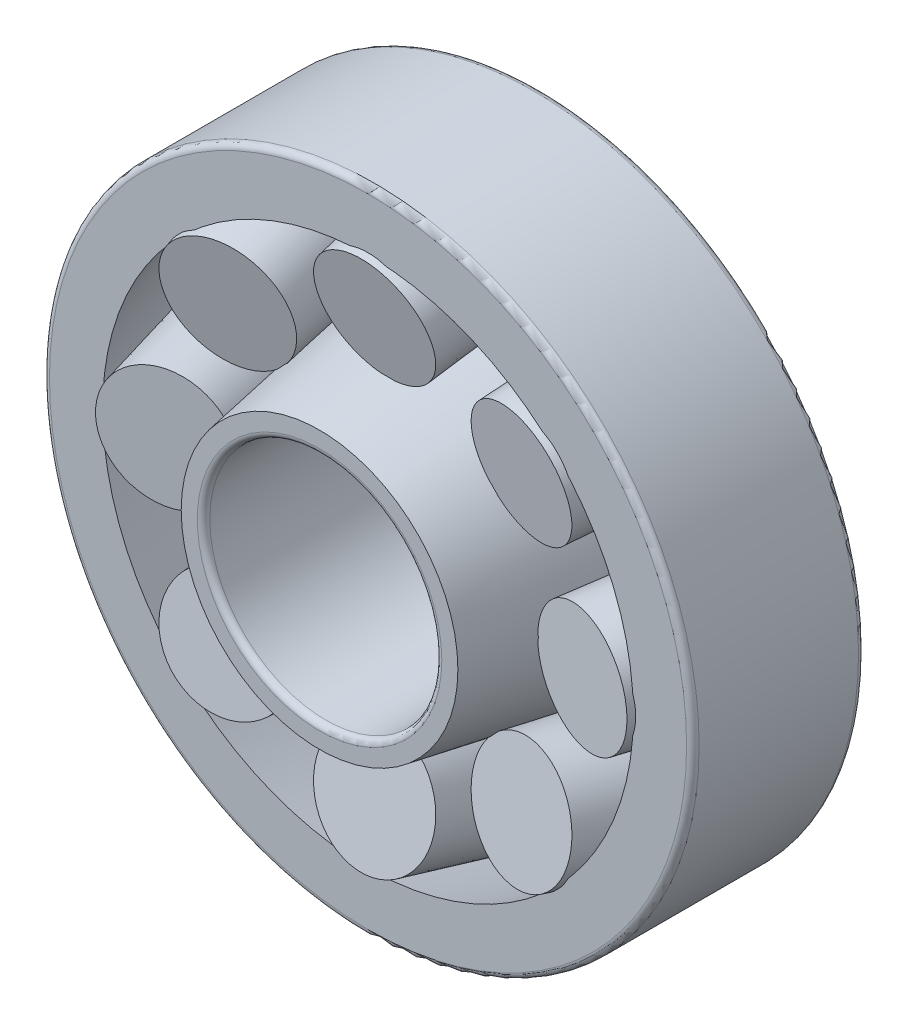
ISO-10303-21;
HEADER;
FILE_DESCRIPTION(('STEP AP214'),'2;1');
FILE_NAME('part.step','',(''),(''),'','','');
FILE_SCHEMA(('AUTOMOTIVE_DESIGN { 1 0 10303 214 1 1 1 1 }'));
ENDSEC;
DATA;
#1=APPLICATION_CONTEXT('core data for automotive mechanical design processes');
#2=APPLICATION_PROTOCOL_DEFINITION('international standard','automotive_design',2000,#1);
#3=PRODUCT_CONTEXT('',#1,'mechanical');
#4=PRODUCT('Part','Part','',(#3));
#5=PRODUCT_RELATED_PRODUCT_CATEGORY('part','',(#4));
#6=PRODUCT_DEFINITION_FORMATION('','',#4);
#7=PRODUCT_DEFINITION_CONTEXT('part definition',#1,'design');
#8=PRODUCT_DEFINITION('design','',#6,#7);
#9=PRODUCT_DEFINITION_SHAPE('','',#8);
#10=(LENGTH_UNIT() NAMED_UNIT(*) SI_UNIT(.MILLI.,.METRE.));
#11=(NAMED_UNIT(*) PLANE_ANGLE_UNIT() SI_UNIT($,.RADIAN.));
#12=(NAMED_UNIT(*) SI_UNIT($,.STERADIAN.) SOLID_ANGLE_UNIT());
#13=UNCERTAINTY_MEASURE_WITH_UNIT(LENGTH_MEASURE(1.E-05),#10,'distance_accuracy_value','');
#14=(GEOMETRIC_REPRESENTATION_CONTEXT(3) GLOBAL_UNCERTAINTY_ASSIGNED_CONTEXT((#13)) GLOBAL_UNIT_ASSIGNED_CONTEXT((#10,
#11,#12)) REPRESENTATION_CONTEXT('',''));
#15=CARTESIAN_POINT('',(0.,0.,0.));
#16=DIRECTION('',(0.,0.,1.));
#17=DIRECTION('',(1.,0.,0.));
#18=AXIS2_PLACEMENT_3D('',#15,#16,#17);
#19=CARTESIAN_POINT('',(9.49301667362591,-9.49301667362592,3.56250031236652));
#20=DIRECTION('',(0.159501582379891,-0.159501582379891,-0.974227124666842));
#21=DIRECTION('',(-0.688882606267796,0.688882606267796,-0.225569301021612));
#22=AXIS2_PLACEMENT_3D('',#19,#20,#21);
#23=PLANE('',#22);
#24=CARTESIAN_POINT('',(9.49301662248491,-9.49301662248491,3.56250062473305));
#25=DIRECTION('',(0.159501582379891,-0.159501582379891,-0.974227124666842));
#26=DIRECTION('',(-0.688882606267796,0.688882606267796,-0.225569301021612));
#27=AXIS2_PLACEMENT_3D('',#24,#25,#26);
#28=CIRCLE('',#27,3.8533147965187);
#29=CARTESIAN_POINT('',(6.83853508268885,-6.83853508268885,2.69331109946609));
#30=VERTEX_POINT('',#29);
#31=EDGE_CURVE('E11',#30,#30,#28,.T.);
#32=ORIENTED_EDGE('',*,*,#31,.F.);
#33=EDGE_LOOP('',(#32));
#34=FACE_BOUND('',#33,.T.);
#35=ADVANCED_FACE('F42',(#34),#23,.F.);
#36=CARTESIAN_POINT('',(9.49301662248491,-9.49301662248491,3.56250062473305));
#37=DIRECTION('',(0.159501582379891,-0.159501582379891,-0.974227124666842));
#38=DIRECTION('',(-0.688882606267796,0.688882606267796,-0.225569301021612));
#39=AXIS2_PLACEMENT_3D('',#36,#37,#38);
#40=CONICAL_SURFACE('',#39,3.8533147965187,0.0537348200458138);
#41=CARTESIAN_POINT('',(10.892832765174,-10.892832765174,-4.98750142168032));
#42=DIRECTION('',(0.159501582379891,-0.159501582379891,-0.974227124666842));
#43=DIRECTION('',(-0.688882606267796,0.688882606267796,-0.225569301021612));
#44=AXIS2_PLACEMENT_3D('',#41,#42,#43);
#45=CIRCLE('',#44,4.32535618659756);
#46=CARTESIAN_POINT('',(7.91317012231415,-7.91317012231416,-5.96316899336063));
#47=VERTEX_POINT('',#46);
#48=EDGE_CURVE('E48',#47,#47,#45,.T.);
#49=ORIENTED_EDGE('',*,*,#48,.F.);
#50=EDGE_LOOP('',(#49));
#51=FACE_BOUND('',#50,.T.);
#52=ORIENTED_EDGE('',*,*,#31,.T.);
#53=EDGE_LOOP('',(#52));
#54=FACE_BOUND('',#53,.T.);
#55=ADVANCED_FACE('F56',(#51,#54),#40,.T.);
#56=CARTESIAN_POINT('',(13.8724952916543,-13.8724952916543,-4.01183313915984));
#57=DIRECTION('',(-0.159501582379891,0.159501582379891,0.974227124666842));
#58=DIRECTION('',(0.688882606267796,-0.688882606267796,0.225569301021612));
#59=AXIS2_PLACEMENT_3D('',#56,#57,#58);
#60=PLANE('',#59);
#61=ORIENTED_EDGE('',*,*,#48,.T.);
#62=EDGE_LOOP('',(#61));
#63=FACE_BOUND('',#62,.T.);
#64=ADVANCED_FACE('F54',(#63),#60,.F.);
#65=CLOSED_SHELL('',(#35,#55,#64));
#66=MANIFOLD_SOLID_BREP('B2',#65);
#67=CARTESIAN_POINT('',(0.,-13.4251529276757,3.56250031236652));
#68=DIRECTION('',(0.,-0.225569301021612,-0.974227124666842));
#69=DIRECTION('',(0.,0.974227124666842,-0.225569301021612));
#70=AXIS2_PLACEMENT_3D('',#67,#68,#69);
#71=PLANE('',#70);
#72=CARTESIAN_POINT('',(0.,-13.4251528553514,3.56250062473305));
#73=DIRECTION('',(0.,-0.225569301021612,-0.974227124666842));
#74=DIRECTION('',(0.,0.974227124666842,-0.225569301021612));
#75=AXIS2_PLACEMENT_3D('',#72,#73,#74);
#76=CIRCLE('',#75,3.8533147965187);
#77=CARTESIAN_POINT('',(0.,-9.67114906070278,2.69331109946609));
#78=VERTEX_POINT('',#77);
#79=EDGE_CURVE('E41',#78,#78,#76,.T.);
#80=ORIENTED_EDGE('',*,*,#79,.F.);
#81=EDGE_LOOP('',(#80));
#82=FACE_BOUND('',#81,.T.);
#83=ADVANCED_FACE('F91',(#82),#71,.F.);
#84=CARTESIAN_POINT('',(0.,-13.4251528553514,3.56250062473305));
#85=DIRECTION('',(0.,-0.225569301021612,-0.974227124666842));
#86=DIRECTION('',(0.,0.974227124666842,-0.225569301021612));
#87=AXIS2_PLACEMENT_3D('',#84,#85,#86);
#88=CONICAL_SURFACE('',#87,3.8533147965187,0.0537348200458138);
#89=CARTESIAN_POINT('',(0.,-15.4047918291711,-4.98750142168032));
#90=DIRECTION('',(0.,-0.225569301021612,-0.974227124666842));
#91=DIRECTION('',(0.,0.974227124666842,-0.225569301021612));
#92=AXIS2_PLACEMENT_3D('',#89,#90,#91);
#93=CIRCLE('',#92,4.32535618659756);
#94=CARTESIAN_POINT('',(0.,-11.1909125083422,-5.96316899336063));
#95=VERTEX_POINT('',#94);
#96=EDGE_CURVE('E97',#95,#95,#93,.T.);
#97=ORIENTED_EDGE('',*,*,#96,.F.);
#98=EDGE_LOOP('',(#97));
#99=FACE_BOUND('',#98,.T.);
#100=ORIENTED_EDGE('',*,*,#79,.T.);
#101=EDGE_LOOP('',(#100));
#102=FACE_BOUND('',#101,.T.);
#103=ADVANCED_FACE('F105',(#99,#102),#88,.T.);
#104=CARTESIAN_POINT('',(0.,-19.6186709854144,-4.01183313915984));
#105=DIRECTION('',(0.,0.225569301021612,0.974227124666842));
#106=DIRECTION('',(0.,-0.974227124666842,0.225569301021612));
#107=AXIS2_PLACEMENT_3D('',#104,#105,#106);
#108=PLANE('',#107);
#109=ORIENTED_EDGE('',*,*,#96,.T.);
#110=EDGE_LOOP('',(#109));
#111=FACE_BOUND('',#110,.T.);
#112=ADVANCED_FACE('F103',(#111),#108,.F.);
#113=CLOSED_SHELL('',(#83,#103,#112));
#114=MANIFOLD_SOLID_BREP('B6',#113);
#115=CARTESIAN_POINT('',(-9.49301667362592,-9.49301667362592,3.56250031236652));
#116=DIRECTION('',(-0.159501582379891,-0.159501582379891,-0.974227124666842));
#117=DIRECTION('',(0.688882606267796,0.688882606267796,-0.225569301021612));
#118=AXIS2_PLACEMENT_3D('',#115,#116,#117);
#119=PLANE('',#118);
#120=CARTESIAN_POINT('',(-9.49301662248491,-9.49301662248491,3.56250062473305));
#121=DIRECTION('',(-0.159501582379891,-0.159501582379891,-0.974227124666842));
#122=DIRECTION('',(0.688882606267796,0.688882606267796,-0.225569301021612));
#123=AXIS2_PLACEMENT_3D('',#120,#121,#122);
#124=CIRCLE('',#123,3.8533147965187);
#125=CARTESIAN_POINT('',(-6.83853508268885,-6.83853508268885,2.69331109946609));
#126=VERTEX_POINT('',#125);
#127=EDGE_CURVE('E90',#126,#126,#124,.T.);
#128=ORIENTED_EDGE('',*,*,#127,.F.);
#129=EDGE_LOOP('',(#128));
#130=FACE_BOUND('',#129,.T.);
#131=ADVANCED_FACE('F140',(#130),#119,.F.);
#132=CARTESIAN_POINT('',(-9.49301662248491,-9.49301662248491,3.56250062473305));
#133=DIRECTION('',(-0.159501582379891,-0.159501582379891,-0.974227124666842));
#134=DIRECTION('',(0.688882606267796,0.688882606267796,-0.225569301021612));
#135=AXIS2_PLACEMENT_3D('',#132,#133,#134);
#136=CONICAL_SURFACE('',#135,3.8533147965187,0.0537348200458138);
#137=CARTESIAN_POINT('',(-10.892832765174,-10.892832765174,-4.98750142168032));
#138=DIRECTION('',(-0.159501582379891,-0.159501582379891,-0.974227124666842));
#139=DIRECTION('',(0.688882606267796,0.688882606267796,-0.225569301021612));
#140=AXIS2_PLACEMENT_3D('',#137,#138,#139);
#141=CIRCLE('',#140,4.32535618659756);
#142=CARTESIAN_POINT('',(-7.91317012231416,-7.91317012231416,-5.96316899336063));
#143=VERTEX_POINT('',#142);
#144=EDGE_CURVE('E146',#143,#143,#141,.T.);
#145=ORIENTED_EDGE('',*,*,#144,.F.);
#146=EDGE_LOOP('',(#145));
#147=FACE_BOUND('',#146,.T.);
#148=ORIENTED_EDGE('',*,*,#127,.T.);
#149=EDGE_LOOP('',(#148));
#150=FACE_BOUND('',#149,.T.);
#151=ADVANCED_FACE('F154',(#147,#150),#136,.T.);
#152=CARTESIAN_POINT('',(-13.8724952916543,-13.8724952916543,-4.01183313915984));
#153=DIRECTION('',(0.159501582379891,0.159501582379891,0.974227124666842));
#154=DIRECTION('',(-0.688882606267796,-0.688882606267796,0.225569301021612));
#155=AXIS2_PLACEMENT_3D('',#152,#153,#154);
#156=PLANE('',#155);
#157=ORIENTED_EDGE('',*,*,#144,.T.);
#158=EDGE_LOOP('',(#157));
#159=FACE_BOUND('',#158,.T.);
#160=ADVANCED_FACE('F152',(#159),#156,.F.);
#161=CLOSED_SHELL('',(#131,#151,#160));
#162=MANIFOLD_SOLID_BREP('B36',#161);
#163=CARTESIAN_POINT('',(-13.4251529276757,0.,3.56250031236652));
#164=DIRECTION('',(-0.225569301021612,0.,-0.974227124666842));
#165=DIRECTION('',(0.974227124666842,0.,-0.225569301021612));
#166=AXIS2_PLACEMENT_3D('',#163,#164,#165);
#167=PLANE('',#166);
#168=CARTESIAN_POINT('',(-13.4251528553514,0.,3.56250062473305));
#169=DIRECTION('',(-0.225569301021612,0.,-0.974227124666842));
#170=DIRECTION('',(0.974227124666842,0.,-0.225569301021612));
#171=AXIS2_PLACEMENT_3D('',#168,#169,#170);
#172=CIRCLE('',#171,3.8533147965187);
#173=CARTESIAN_POINT('',(-9.67114906070278,0.,2.69331109946609));
#174=VERTEX_POINT('',#173);
#175=EDGE_CURVE('E139',#174,#174,#172,.T.);
#176=ORIENTED_EDGE('',*,*,#175,.F.);
#177=EDGE_LOOP('',(#176));
#178=FACE_BOUND('',#177,.T.);
#179=ADVANCED_FACE('F189',(#178),#167,.F.);
#180=CARTESIAN_POINT('',(-13.4251528553514,0.,3.56250062473305));
#181=DIRECTION('',(-0.225569301021612,0.,-0.974227124666842));
#182=DIRECTION('',(0.974227124666842,0.,-0.225569301021612));
#183=AXIS2_PLACEMENT_3D('',#180,#181,#182);
#184=CONICAL_SURFACE('',#183,3.8533147965187,0.0537348200458138);
#185=CARTESIAN_POINT('',(-15.4047918291711,0.,-4.98750142168032));
#186=DIRECTION('',(-0.225569301021612,0.,-0.974227124666842));
#187=DIRECTION('',(0.974227124666842,0.,-0.225569301021612));
#188=AXIS2_PLACEMENT_3D('',#185,#186,#187);
#189=CIRCLE('',#188,4.32535618659756);
#190=CARTESIAN_POINT('',(-11.1909125083422,0.,-5.96316899336063));
#191=VERTEX_POINT('',#190);
#192=EDGE_CURVE('E195',#191,#191,#189,.T.);
#193=ORIENTED_EDGE('',*,*,#192,.F.);
#194=EDGE_LOOP('',(#193));
#195=FACE_BOUND('',#194,.T.);
#196=ORIENTED_EDGE('',*,*,#175,.T.);
#197=EDGE_LOOP('',(#196));
#198=FACE_BOUND('',#197,.T.);
#199=ADVANCED_FACE('F203',(#195,#198),#184,.T.);
#200=CARTESIAN_POINT('',(-19.6186709854144,0.,-4.01183313915984));
#201=DIRECTION('',(0.225569301021612,0.,0.974227124666842));
#202=DIRECTION('',(-0.974227124666842,0.,0.225569301021612));
#203=AXIS2_PLACEMENT_3D('',#200,#201,#202);
#204=PLANE('',#203);
#205=ORIENTED_EDGE('',*,*,#192,.T.);
#206=EDGE_LOOP('',(#205));
#207=FACE_BOUND('',#206,.T.);
#208=ADVANCED_FACE('F201',(#207),#204,.F.);
#209=CLOSED_SHELL('',(#179,#199,#208));
#210=MANIFOLD_SOLID_BREP('B85',#209);
#211=CARTESIAN_POINT('',(-9.49301667362592,9.49301667362592,3.56250031236652));
#212=DIRECTION('',(-0.159501582379891,0.159501582379891,-0.974227124666842));
#213=DIRECTION('',(0.688882606267796,-0.688882606267796,-0.225569301021612));
#214=AXIS2_PLACEMENT_3D('',#211,#212,#213);
#215=PLANE('',#214);
#216=CARTESIAN_POINT('',(-9.49301662248491,9.49301662248491,3.56250062473305));
#217=DIRECTION('',(-0.159501582379891,0.159501582379891,-0.974227124666842));
#218=DIRECTION('',(0.688882606267796,-0.688882606267796,-0.225569301021612));
#219=AXIS2_PLACEMENT_3D('',#216,#217,#218);
#220=CIRCLE('',#219,3.8533147965187);
#221=CARTESIAN_POINT('',(-6.83853508268885,6.83853508268885,2.69331109946609));
#222=VERTEX_POINT('',#221);
#223=EDGE_CURVE('E188',#222,#222,#220,.T.);
#224=ORIENTED_EDGE('',*,*,#223,.F.);
#225=EDGE_LOOP('',(#224));
#226=FACE_BOUND('',#225,.T.);
#227=ADVANCED_FACE('F238',(#226),#215,.F.);
#228=CARTESIAN_POINT('',(-9.49301662248491,9.49301662248491,3.56250062473305));
#229=DIRECTION('',(-0.159501582379891,0.159501582379891,-0.974227124666842));
#230=DIRECTION('',(0.688882606267796,-0.688882606267796,-0.225569301021612));
#231=AXIS2_PLACEMENT_3D('',#228,#229,#230);
#232=CONICAL_SURFACE('',#231,3.8533147965187,0.0537348200458138);
#233=CARTESIAN_POINT('',(-10.892832765174,10.892832765174,-4.98750142168032));
#234=DIRECTION('',(-0.159501582379891,0.159501582379891,-0.974227124666842));
#235=DIRECTION('',(0.688882606267796,-0.688882606267796,-0.225569301021612));
#236=AXIS2_PLACEMENT_3D('',#233,#234,#235);
#237=CIRCLE('',#236,4.32535618659756);
#238=CARTESIAN_POINT('',(-7.91317012231416,7.91317012231416,-5.96316899336063));
#239=VERTEX_POINT('',#238);
#240=EDGE_CURVE('E244',#239,#239,#237,.T.);
#241=ORIENTED_EDGE('',*,*,#240,.F.);
#242=EDGE_LOOP('',(#241));
#243=FACE_BOUND('',#242,.T.);
#244=ORIENTED_EDGE('',*,*,#223,.T.);
#245=EDGE_LOOP('',(#244));
#246=FACE_BOUND('',#245,.T.);
#247=ADVANCED_FACE('F252',(#243,#246),#232,.T.);
#248=CARTESIAN_POINT('',(-13.8724952916543,13.8724952916543,-4.01183313915984));
#249=DIRECTION('',(0.159501582379891,-0.159501582379891,0.974227124666842));
#250=DIRECTION('',(-0.688882606267796,0.688882606267796,0.225569301021612));
#251=AXIS2_PLACEMENT_3D('',#248,#249,#250);
#252=PLANE('',#251);
#253=ORIENTED_EDGE('',*,*,#240,.T.);
#254=EDGE_LOOP('',(#253));
#255=FACE_BOUND('',#254,.T.);
#256=ADVANCED_FACE('F250',(#255),#252,.F.);
#257=CLOSED_SHELL('',(#227,#247,#256));
#258=MANIFOLD_SOLID_BREP('B134',#257);
#259=CARTESIAN_POINT('',(0.,13.4251529276757,3.56250031236652));
#260=DIRECTION('',(0.,0.225569301021612,-0.974227124666842));
#261=DIRECTION('',(0.,-0.974227124666842,-0.225569301021612));
#262=AXIS2_PLACEMENT_3D('',#259,#260,#261);
#263=PLANE('',#262);
#264=CARTESIAN_POINT('',(0.,13.4251528553514,3.56250062473305));
#265=DIRECTION('',(0.,0.225569301021612,-0.974227124666842));
#266=DIRECTION('',(0.,-0.974227124666842,-0.225569301021612));
#267=AXIS2_PLACEMENT_3D('',#264,#265,#266);
#268=CIRCLE('',#267,3.8533147965187);
#269=CARTESIAN_POINT('',(0.,9.67114906070278,2.69331109946609));
#270=VERTEX_POINT('',#269);
#271=EDGE_CURVE('E237',#270,#270,#268,.T.);
#272=ORIENTED_EDGE('',*,*,#271,.F.);
#273=EDGE_LOOP('',(#272));
#274=FACE_BOUND('',#273,.T.);
#275=ADVANCED_FACE('F287',(#274),#263,.F.);
#276=CARTESIAN_POINT('',(0.,13.4251528553514,3.56250062473305));
#277=DIRECTION('',(0.,0.225569301021612,-0.974227124666842));
#278=DIRECTION('',(0.,-0.974227124666842,-0.225569301021612));
#279=AXIS2_PLACEMENT_3D('',#276,#277,#278);
#280=CONICAL_SURFACE('',#279,3.8533147965187,0.0537348200458138);
#281=CARTESIAN_POINT('',(0.,15.4047918291711,-4.98750142168032));
#282=DIRECTION('',(0.,0.225569301021612,-0.974227124666842));
#283=DIRECTION('',(0.,-0.974227124666842,-0.225569301021612));
#284=AXIS2_PLACEMENT_3D('',#281,#282,#283);
#285=CIRCLE('',#284,4.32535618659756);
#286=CARTESIAN_POINT('',(0.,11.1909125083422,-5.96316899336063));
#287=VERTEX_POINT('',#286);
#288=EDGE_CURVE('E293',#287,#287,#285,.T.);
#289=ORIENTED_EDGE('',*,*,#288,.F.);
#290=EDGE_LOOP('',(#289));
#291=FACE_BOUND('',#290,.T.);
#292=ORIENTED_EDGE('',*,*,#271,.T.);
#293=EDGE_LOOP('',(#292));
#294=FACE_BOUND('',#293,.T.);
#295=ADVANCED_FACE('F301',(#291,#294),#280,.T.);
#296=CARTESIAN_POINT('',(0.,19.6186709854144,-4.01183313915984));
#297=DIRECTION('',(0.,-0.225569301021612,0.974227124666842));
#298=DIRECTION('',(0.,0.974227124666842,0.225569301021612));
#299=AXIS2_PLACEMENT_3D('',#296,#297,#298);
#300=PLANE('',#299);
#301=ORIENTED_EDGE('',*,*,#288,.T.);
#302=EDGE_LOOP('',(#301));
#303=FACE_BOUND('',#302,.T.);
#304=ADVANCED_FACE('F299',(#303),#300,.F.);
#305=CLOSED_SHELL('',(#275,#295,#304));
#306=MANIFOLD_SOLID_BREP('B183',#305);
#307=CARTESIAN_POINT('',(9.49301667362592,9.49301667362592,3.56250031236652));
#308=DIRECTION('',(0.159501582379891,0.159501582379891,-0.974227124666842));
#309=DIRECTION('',(-0.688882606267796,-0.688882606267796,-0.225569301021612));
#310=AXIS2_PLACEMENT_3D('',#307,#308,#309);
#311=PLANE('',#310);
#312=CARTESIAN_POINT('',(9.49301662248491,9.49301662248491,3.56250062473305));
#313=DIRECTION('',(0.159501582379891,0.159501582379891,-0.974227124666842));
#314=DIRECTION('',(-0.688882606267796,-0.688882606267796,-0.225569301021612));
#315=AXIS2_PLACEMENT_3D('',#312,#313,#314);
#316=CIRCLE('',#315,3.8533147965187);
#317=CARTESIAN_POINT('',(6.83853508268885,6.83853508268885,2.69331109946609));
#318=VERTEX_POINT('',#317);
#319=EDGE_CURVE('E286',#318,#318,#316,.T.);
#320=ORIENTED_EDGE('',*,*,#319,.F.);
#321=EDGE_LOOP('',(#320));
#322=FACE_BOUND('',#321,.T.);
#323=ADVANCED_FACE('F336',(#322),#311,.F.);
#324=CARTESIAN_POINT('',(9.49301662248491,9.49301662248491,3.56250062473305));
#325=DIRECTION('',(0.159501582379891,0.159501582379891,-0.974227124666842));
#326=DIRECTION('',(-0.688882606267796,-0.688882606267796,-0.225569301021612));
#327=AXIS2_PLACEMENT_3D('',#324,#325,#326);
#328=CONICAL_SURFACE('',#327,3.8533147965187,0.0537348200458138);
#329=CARTESIAN_POINT('',(10.892832765174,10.892832765174,-4.98750142168032));
#330=DIRECTION('',(0.159501582379891,0.159501582379891,-0.974227124666842));
#331=DIRECTION('',(-0.688882606267796,-0.688882606267796,-0.225569301021612));
#332=AXIS2_PLACEMENT_3D('',#329,#330,#331);
#333=CIRCLE('',#332,4.32535618659756);
#334=CARTESIAN_POINT('',(7.91317012231416,7.91317012231416,-5.96316899336063));
#335=VERTEX_POINT('',#334);
#336=EDGE_CURVE('E342',#335,#335,#333,.T.);
#337=ORIENTED_EDGE('',*,*,#336,.F.);
#338=EDGE_LOOP('',(#337));
#339=FACE_BOUND('',#338,.T.);
#340=ORIENTED_EDGE('',*,*,#319,.T.);
#341=EDGE_LOOP('',(#340));
#342=FACE_BOUND('',#341,.T.);
#343=ADVANCED_FACE('F350',(#339,#342),#328,.T.);
#344=CARTESIAN_POINT('',(13.8724952916543,13.8724952916543,-4.01183313915984));
#345=DIRECTION('',(-0.159501582379891,-0.159501582379891,0.974227124666842));
#346=DIRECTION('',(0.688882606267796,0.688882606267796,0.225569301021612));
#347=AXIS2_PLACEMENT_3D('',#344,#345,#346);
#348=PLANE('',#347);
#349=ORIENTED_EDGE('',*,*,#336,.T.);
#350=EDGE_LOOP('',(#349));
#351=FACE_BOUND('',#350,.T.);
#352=ADVANCED_FACE('F348',(#351),#348,.F.);
#353=CLOSED_SHELL('',(#323,#343,#352));
#354=MANIFOLD_SOLID_BREP('B232',#353);
#355=CARTESIAN_POINT('',(13.4251529276757,0.,3.56250031236652));
#356=DIRECTION('',(0.225569301021612,0.,-0.974227124666842));
#357=DIRECTION('',(-0.974227124666842,0.,-0.225569301021612));
#358=AXIS2_PLACEMENT_3D('',#355,#356,#357);
#359=PLANE('',#358);
#360=CARTESIAN_POINT('',(13.4251528553514,0.,3.56250062473305));
#361=DIRECTION('',(0.225569301021612,0.,-0.974227124666842));
#362=DIRECTION('',(-0.974227124666842,0.,-0.225569301021612));
#363=AXIS2_PLACEMENT_3D('',#360,#361,#362);
#364=CIRCLE('',#363,3.8533147965187);
#365=CARTESIAN_POINT('',(9.67114906070278,0.,2.69331109946609));
#366=VERTEX_POINT('',#365);
#367=EDGE_CURVE('E335',#366,#366,#364,.T.);
#368=ORIENTED_EDGE('',*,*,#367,.F.);
#369=EDGE_LOOP('',(#368));
#370=FACE_BOUND('',#369,.T.);
#371=ADVANCED_FACE('F385',(#370),#359,.F.);
#372=CARTESIAN_POINT('',(13.4251528553514,0.,3.56250062473305));
#373=DIRECTION('',(0.225569301021612,0.,-0.974227124666842));
#374=DIRECTION('',(-0.974227124666842,0.,-0.225569301021612));
#375=AXIS2_PLACEMENT_3D('',#372,#373,#374);
#376=CONICAL_SURFACE('',#375,3.8533147965187,0.0537348200458138);
#377=CARTESIAN_POINT('',(15.4047918291711,0.,-4.98750142168032));
#378=DIRECTION('',(0.225569301021612,0.,-0.974227124666842));
#379=DIRECTION('',(-0.974227124666842,0.,-0.225569301021612));
#380=AXIS2_PLACEMENT_3D('',#377,#378,#379);
#381=CIRCLE('',#380,4.32535618659756);
#382=CARTESIAN_POINT('',(11.1909125083422,0.,-5.96316899336063));
#383=VERTEX_POINT('',#382);
#384=EDGE_CURVE('E391',#383,#383,#381,.T.);
#385=ORIENTED_EDGE('',*,*,#384,.F.);
#386=EDGE_LOOP('',(#385));
#387=FACE_BOUND('',#386,.T.);
#388=ORIENTED_EDGE('',*,*,#367,.T.);
#389=EDGE_LOOP('',(#388));
#390=FACE_BOUND('',#389,.T.);
#391=ADVANCED_FACE('F399',(#387,#390),#376,.T.);
#392=CARTESIAN_POINT('',(19.6186709854144,0.,-4.01183313915984));
#393=DIRECTION('',(-0.225569301021612,0.,0.974227124666842));
#394=DIRECTION('',(0.974227124666842,0.,0.225569301021612));
#395=AXIS2_PLACEMENT_3D('',#392,#393,#394);
#396=PLANE('',#395);
#397=ORIENTED_EDGE('',*,*,#384,.T.);
#398=EDGE_LOOP('',(#397));
#399=FACE_BOUND('',#398,.T.);
#400=ADVANCED_FACE('F397',(#399),#396,.F.);
#401=CLOSED_SHELL('',(#371,#391,#400));
#402=MANIFOLD_SOLID_BREP('B281',#401);
#403=CARTESIAN_POINT('',(0.,0.,-7.12500000000001));
#404=DIRECTION('',(0.,0.,-1.));
#405=DIRECTION('',(-1.,0.,0.));
#406=AXIS2_PLACEMENT_3D('',#403,#404,#405);
#407=CONICAL_SURFACE('',#406,20.34306525,0.279253390050127);
#408=CARTESIAN_POINT('',(0.,0.,3.99));
#409=DIRECTION('',(0.,0.,1.));
#410=DIRECTION('',(1.,0.,0.));
#411=AXIS2_PLACEMENT_3D('',#408,#409,#410);
#412=CIRCLE('',#411,17.15588175);
#413=CARTESIAN_POINT('',(17.15588175,0.,3.99));
#414=VERTEX_POINT('',#413);
#415=EDGE_CURVE('E453',#414,#414,#412,.T.);
#416=ORIENTED_EDGE('',*,*,#415,.T.);
#417=EDGE_LOOP('',(#416));
#418=FACE_BOUND('',#417,.T.);
#419=CARTESIAN_POINT('',(0.,0.,-7.12500000000001));
#420=DIRECTION('',(0.,0.,1.));
#421=DIRECTION('',(1.,0.,0.));
#422=AXIS2_PLACEMENT_3D('',#419,#420,#421);
#423=CIRCLE('',#422,20.34306525);
#424=CARTESIAN_POINT('',(20.34306525,0.,-7.12500000000001));
#425=VERTEX_POINT('',#424);
#426=EDGE_CURVE('E456',#425,#425,#423,.T.);
#427=ORIENTED_EDGE('',*,*,#426,.F.);
#428=EDGE_LOOP('',(#427));
#429=FACE_BOUND('',#428,.T.);
#430=ADVANCED_FACE('F433',(#418,#429),#407,.F.);
#431=CARTESIAN_POINT('',(17.15588175,0.,3.99));
#432=DIRECTION('',(0.,0.,1.));
#433=DIRECTION('',(1.,0.,0.));
#434=AXIS2_PLACEMENT_3D('',#431,#432,#433);
#435=PLANE('',#434);
#436=CARTESIAN_POINT('',(0.,0.,3.99));
#437=DIRECTION('',(0.,0.,1.));
#438=DIRECTION('',(1.,0.,0.));
#439=AXIS2_PLACEMENT_3D('',#436,#437,#438);
#440=CIRCLE('',#439,20.595);
#441=CARTESIAN_POINT('',(20.595,0.,3.99));
#442=VERTEX_POINT('',#441);
#443=EDGE_CURVE('E384',#442,#442,#440,.T.);
#444=ORIENTED_EDGE('',*,*,#443,.T.);
#445=EDGE_LOOP('',(#444));
#446=FACE_BOUND('',#445,.T.);
#447=ORIENTED_EDGE('',*,*,#415,.F.);
#448=EDGE_LOOP('',(#447));
#449=FACE_BOUND('',#448,.T.);
#450=ADVANCED_FACE('F463',(#446,#449),#435,.T.);
#451=CARTESIAN_POINT('',(0.,0.,11.6875));
#452=DIRECTION('',(0.,0.,1.));
#453=DIRECTION('',(1.,0.,0.));
#454=AXIS2_PLACEMENT_3D('',#451,#452,#453);
#455=CYLINDRICAL_SURFACE('',#454,21.);
#456=CARTESIAN_POINT('',(0.,0.,-6.72));
#457=DIRECTION('',(0.,0.,-1.));
#458=DIRECTION('',(-1.,0.,0.));
#459=AXIS2_PLACEMENT_3D('',#456,#457,#458);
#460=CIRCLE('',#459,21.);
#461=CARTESIAN_POINT('',(-21.,0.,-6.72));
#462=VERTEX_POINT('',#461);
#463=EDGE_CURVE('E444',#462,#462,#460,.F.);
#464=ORIENTED_EDGE('',*,*,#463,.T.);
#465=EDGE_LOOP('',(#464));
#466=FACE_BOUND('',#465,.T.);
#467=CARTESIAN_POINT('',(0.,0.,3.585));
#468=DIRECTION('',(0.,0.,1.));
#469=DIRECTION('',(1.,0.,0.));
#470=AXIS2_PLACEMENT_3D('',#467,#468,#469);
#471=CIRCLE('',#470,21.);
#472=CARTESIAN_POINT('',(21.,0.,3.585));
#473=VERTEX_POINT('',#472);
#474=EDGE_CURVE('E448',#473,#473,#471,.F.);
#475=ORIENTED_EDGE('',*,*,#474,.T.);
#476=EDGE_LOOP('',(#475));
#477=FACE_BOUND('',#476,.T.);
#478=ADVANCED_FACE('F469',(#466,#477),#455,.T.);
#479=CARTESIAN_POINT('',(21.,0.,-7.125));
#480=DIRECTION('',(0.,0.,-1.));
#481=DIRECTION('',(-1.,0.,0.));
#482=AXIS2_PLACEMENT_3D('',#479,#480,#481);
#483=PLANE('',#482);
#484=CARTESIAN_POINT('',(0.,0.,-7.125));
#485=DIRECTION('',(0.,0.,-1.));
#486=DIRECTION('',(-1.,0.,0.));
#487=AXIS2_PLACEMENT_3D('',#484,#485,#486);
#488=CIRCLE('',#487,20.595);
#489=CARTESIAN_POINT('',(-20.595,0.,-7.125));
#490=VERTEX_POINT('',#489);
#491=EDGE_CURVE('E440',#490,#490,#488,.T.);
#492=ORIENTED_EDGE('',*,*,#491,.T.);
#493=EDGE_LOOP('',(#492));
#494=FACE_BOUND('',#493,.T.);
#495=ORIENTED_EDGE('',*,*,#426,.T.);
#496=EDGE_LOOP('',(#495));
#497=FACE_BOUND('',#496,.T.);
#498=ADVANCED_FACE('F460',(#494,#497),#483,.T.);
#499=CARTESIAN_POINT('',(0.,0.,-6.72));
#500=DIRECTION('',(0.,0.,-1.));
#501=DIRECTION('',(-1.,0.,0.));
#502=AXIS2_PLACEMENT_3D('',#499,#500,#501);
#503=TOROIDAL_SURFACE('',#502,20.595,0.405);
#504=ORIENTED_EDGE('',*,*,#491,.F.);
#505=EDGE_LOOP('',(#504));
#506=FACE_BOUND('',#505,.T.);
#507=ORIENTED_EDGE('',*,*,#463,.F.);
#508=EDGE_LOOP('',(#507));
#509=FACE_BOUND('',#508,.T.);
#510=ADVANCED_FACE('F472',(#506,#509),#503,.T.);
#511=CARTESIAN_POINT('',(0.,0.,3.585));
#512=DIRECTION('',(0.,0.,1.));
#513=DIRECTION('',(1.,0.,0.));
#514=AXIS2_PLACEMENT_3D('',#511,#512,#513);
#515=TOROIDAL_SURFACE('',#514,20.595,0.405);
#516=ORIENTED_EDGE('',*,*,#474,.F.);
#517=EDGE_LOOP('',(#516));
#518=FACE_BOUND('',#517,.T.);
#519=ORIENTED_EDGE('',*,*,#443,.F.);
#520=EDGE_LOOP('',(#519));
#521=FACE_BOUND('',#520,.T.);
#522=ADVANCED_FACE('F435',(#518,#521),#515,.T.);
#523=CLOSED_SHELL('',(#430,#450,#478,#498,#510,#522));
#524=MANIFOLD_SOLID_BREP('B330',#523);
#525=CARTESIAN_POINT('',(0.,0.,11.6875));
#526=DIRECTION('',(0.,0.,1.));
#527=DIRECTION('',(1.,0.,0.));
#528=AXIS2_PLACEMENT_3D('',#525,#526,#527);
#529=CYLINDRICAL_SURFACE('',#528,7.5);
#530=CARTESIAN_POINT('',(0.,0.,-5.295));
#531=DIRECTION('',(0.,0.,-1.));
#532=DIRECTION('',(-1.,0.,0.));
#533=AXIS2_PLACEMENT_3D('',#530,#531,#532);
#534=CIRCLE('',#533,7.5);
#535=CARTESIAN_POINT('',(-7.5,0.,-5.295));
#536=VERTEX_POINT('',#535);
#537=EDGE_CURVE('E532',#536,#536,#534,.T.);
#538=ORIENTED_EDGE('',*,*,#537,.T.);
#539=EDGE_LOOP('',(#538));
#540=FACE_BOUND('',#539,.T.);
#541=CARTESIAN_POINT('',(0.,0.,6.72));
#542=DIRECTION('',(0.,0.,1.));
#543=DIRECTION('',(1.,0.,0.));
#544=AXIS2_PLACEMENT_3D('',#541,#542,#543);
#545=CIRCLE('',#544,7.5);
#546=CARTESIAN_POINT('',(7.5,0.,6.72));
#547=VERTEX_POINT('',#546);
#548=EDGE_CURVE('E536',#547,#547,#545,.T.);
#549=ORIENTED_EDGE('',*,*,#548,.T.);
#550=EDGE_LOOP('',(#549));
#551=FACE_BOUND('',#550,.T.);
#552=ADVANCED_FACE('F525',(#540,#551),#529,.F.);
#553=CARTESIAN_POINT('',(7.5,0.,7.125));
#554=DIRECTION('',(0.,0.,1.));
#555=DIRECTION('',(1.,0.,0.));
#556=AXIS2_PLACEMENT_3D('',#553,#554,#555);
#557=PLANE('',#556);
#558=CARTESIAN_POINT('',(0.,0.,7.125));
#559=DIRECTION('',(0.,0.,1.));
#560=DIRECTION('',(1.,0.,0.));
#561=AXIS2_PLACEMENT_3D('',#558,#559,#560);
#562=CIRCLE('',#561,7.905);
#563=CARTESIAN_POINT('',(7.905,0.,7.125));
#564=VERTEX_POINT('',#563);
#565=EDGE_CURVE('E432',#564,#564,#562,.F.);
#566=ORIENTED_EDGE('',*,*,#565,.T.);
#567=EDGE_LOOP('',(#566));
#568=FACE_BOUND('',#567,.T.);
#569=CARTESIAN_POINT('',(0.,0.,7.125));
#570=DIRECTION('',(0.,0.,1.));
#571=DIRECTION('',(1.,0.,0.));
#572=AXIS2_PLACEMENT_3D('',#569,#570,#571);
#573=CIRCLE('',#572,8.94367725);
#574=CARTESIAN_POINT('',(8.94367725,0.,7.125));
#575=VERTEX_POINT('',#574);
#576=EDGE_CURVE('E545',#575,#575,#573,.T.);
#577=ORIENTED_EDGE('',*,*,#576,.T.);
#578=EDGE_LOOP('',(#577));
#579=FACE_BOUND('',#578,.T.);
#580=ADVANCED_FACE('F565',(#568,#579),#557,.T.);
#581=CARTESIAN_POINT('',(0.,0.,7.125));
#582=DIRECTION('',(0.,0.,-1.));
#583=DIRECTION('',(-1.,0.,0.));
#584=AXIS2_PLACEMENT_3D('',#581,#582,#583);
#585=CONICAL_SURFACE('',#584,8.94367725,0.174532620627137);
#586=CARTESIAN_POINT('',(0.,0.,-5.7));
#587=DIRECTION('',(0.,0.,1.));
#588=DIRECTION('',(1.,0.,0.));
#589=AXIS2_PLACEMENT_3D('',#586,#587,#588);
#590=CIRCLE('',#589,11.20506675);
#591=CARTESIAN_POINT('',(11.20506675,0.,-5.7));
#592=VERTEX_POINT('',#591);
#593=EDGE_CURVE('E548',#592,#592,#590,.T.);
#594=ORIENTED_EDGE('',*,*,#593,.T.);
#595=EDGE_LOOP('',(#594));
#596=FACE_BOUND('',#595,.T.);
#597=ORIENTED_EDGE('',*,*,#576,.F.);
#598=EDGE_LOOP('',(#597));
#599=FACE_BOUND('',#598,.T.);
#600=ADVANCED_FACE('F552',(#596,#599),#585,.T.);
#601=CARTESIAN_POINT('',(11.20506675,0.,-5.7));
#602=DIRECTION('',(0.,0.,-1.));
#603=DIRECTION('',(-1.,0.,0.));
#604=AXIS2_PLACEMENT_3D('',#601,#602,#603);
#605=PLANE('',#604);
#606=CARTESIAN_POINT('',(0.,0.,-5.7));
#607=DIRECTION('',(0.,0.,-1.));
#608=DIRECTION('',(-1.,0.,0.));
#609=AXIS2_PLACEMENT_3D('',#606,#607,#608);
#610=CIRCLE('',#609,7.905);
#611=CARTESIAN_POINT('',(-7.905,0.,-5.7));
#612=VERTEX_POINT('',#611);
#613=EDGE_CURVE('E540',#612,#612,#610,.F.);
#614=ORIENTED_EDGE('',*,*,#613,.T.);
#615=EDGE_LOOP('',(#614));
#616=FACE_BOUND('',#615,.T.);
#617=ORIENTED_EDGE('',*,*,#593,.F.);
#618=EDGE_LOOP('',(#617));
#619=FACE_BOUND('',#618,.T.);
#620=ADVANCED_FACE('F555',(#616,#619),#605,.T.);
#621=CARTESIAN_POINT('',(0.,0.,-5.295));
#622=DIRECTION('',(0.,0.,-1.));
#623=DIRECTION('',(-1.,0.,0.));
#624=AXIS2_PLACEMENT_3D('',#621,#622,#623);
#625=TOROIDAL_SURFACE('',#624,7.905,0.405);
#626=ORIENTED_EDGE('',*,*,#537,.F.);
#627=EDGE_LOOP('',(#626));
#628=FACE_BOUND('',#627,.T.);
#629=ORIENTED_EDGE('',*,*,#613,.F.);
#630=EDGE_LOOP('',(#629));
#631=FACE_BOUND('',#630,.T.);
#632=ADVANCED_FACE('F557',(#628,#631),#625,.T.);
#633=CARTESIAN_POINT('',(0.,0.,6.72));
#634=DIRECTION('',(0.,0.,1.));
#635=DIRECTION('',(1.,0.,0.));
#636=AXIS2_PLACEMENT_3D('',#633,#634,#635);
#637=TOROIDAL_SURFACE('',#636,7.905,0.405);
#638=ORIENTED_EDGE('',*,*,#565,.F.);
#639=EDGE_LOOP('',(#638));
#640=FACE_BOUND('',#639,.T.);
#641=ORIENTED_EDGE('',*,*,#548,.F.);
#642=EDGE_LOOP('',(#641));
#643=FACE_BOUND('',#642,.T.);
#644=ADVANCED_FACE('F527',(#640,#643),#637,.T.);
#645=CLOSED_SHELL('',(#552,#580,#600,#620,#632,#644));
#646=MANIFOLD_SOLID_BREP('B379',#645);
#647=ADVANCED_BREP_SHAPE_REPRESENTATION('',(#18,#66,#114,#162,#210,#258,#306,#354,#402,#524,
#646),#14);
#648=SHAPE_DEFINITION_REPRESENTATION(#9,#647);
ENDSEC;
END-ISO-10303-21;
